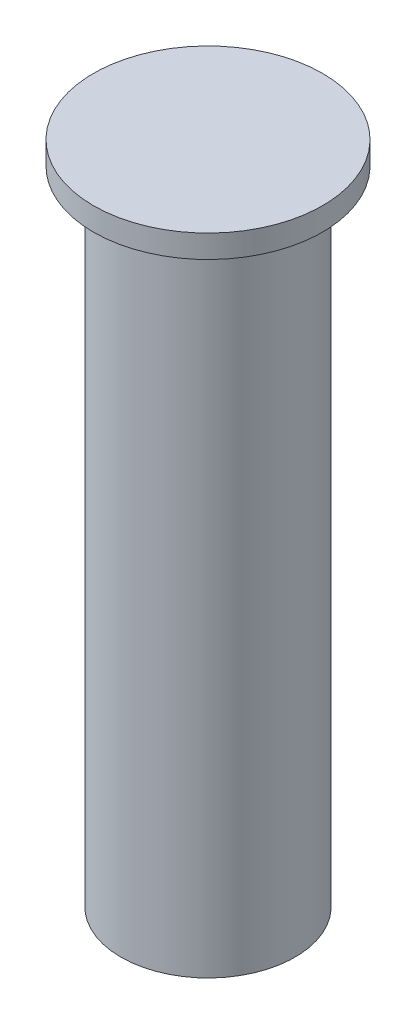
ISO-10303-21;
HEADER;
FILE_DESCRIPTION(('STEP AP214'),'2;1');
FILE_NAME('part.step','',(''),(''),'','','');
FILE_SCHEMA(('AUTOMOTIVE_DESIGN { 1 0 10303 214 1 1 1 1 }'));
ENDSEC;
DATA;
#1=APPLICATION_CONTEXT('core data for automotive mechanical design processes');
#2=APPLICATION_PROTOCOL_DEFINITION('international standard','automotive_design',2000,#1);
#3=PRODUCT_CONTEXT('',#1,'mechanical');
#4=PRODUCT('Part','Part','',(#3));
#5=PRODUCT_RELATED_PRODUCT_CATEGORY('part','',(#4));
#6=PRODUCT_DEFINITION_FORMATION('','',#4);
#7=PRODUCT_DEFINITION_CONTEXT('part definition',#1,'design');
#8=PRODUCT_DEFINITION('design','',#6,#7);
#9=PRODUCT_DEFINITION_SHAPE('','',#8);
#10=(LENGTH_UNIT() NAMED_UNIT(*) SI_UNIT(.MILLI.,.METRE.));
#11=(NAMED_UNIT(*) PLANE_ANGLE_UNIT() SI_UNIT($,.RADIAN.));
#12=(NAMED_UNIT(*) SI_UNIT($,.STERADIAN.) SOLID_ANGLE_UNIT());
#13=UNCERTAINTY_MEASURE_WITH_UNIT(LENGTH_MEASURE(1.E-05),#10,'distance_accuracy_value','');
#14=(GEOMETRIC_REPRESENTATION_CONTEXT(3) GLOBAL_UNCERTAINTY_ASSIGNED_CONTEXT((#13)) GLOBAL_UNIT_ASSIGNED_CONTEXT((#10,
#11,#12)) REPRESENTATION_CONTEXT('',''));
#15=CARTESIAN_POINT('',(0.,0.,0.));
#16=DIRECTION('',(0.,0.,1.));
#17=DIRECTION('',(1.,0.,0.));
#18=AXIS2_PLACEMENT_3D('',#15,#16,#17);
#19=CARTESIAN_POINT('',(0.,1400.,0.));
#20=DIRECTION('',(0.,-1.,0.));
#21=DIRECTION('',(0.,0.,-1.));
#22=AXIS2_PLACEMENT_3D('',#19,#20,#21);
#23=CYLINDRICAL_SURFACE('',#22,190.);
#24=CARTESIAN_POINT('',(0.,1400.,0.));
#25=DIRECTION('',(0.,1.,0.));
#26=DIRECTION('',(0.,0.,1.));
#27=AXIS2_PLACEMENT_3D('',#24,#25,#26);
#28=CIRCLE('',#27,190.);
#29=CARTESIAN_POINT('',(0.,1400.,190.));
#30=VERTEX_POINT('',#29);
#31=EDGE_CURVE('E10',#30,#30,#28,.T.);
#32=ORIENTED_EDGE('',*,*,#31,.F.);
#33=EDGE_LOOP('',(#32));
#34=FACE_BOUND('',#33,.T.);
#35=CARTESIAN_POINT('',(0.,0.,0.));
#36=DIRECTION('',(0.,1.,0.));
#37=DIRECTION('',(0.,0.,1.));
#38=AXIS2_PLACEMENT_3D('',#35,#36,#37);
#39=CIRCLE('',#38,190.);
#40=CARTESIAN_POINT('',(0.,0.,190.));
#41=VERTEX_POINT('',#40);
#42=EDGE_CURVE('E52',#41,#41,#39,.T.);
#43=ORIENTED_EDGE('',*,*,#42,.T.);
#44=EDGE_LOOP('',(#43));
#45=FACE_BOUND('',#44,.T.);
#46=ADVANCED_FACE('F49',(#34,#45),#23,.T.);
#47=CARTESIAN_POINT('',(0.,0.,0.));
#48=DIRECTION('',(0.,1.,0.));
#49=DIRECTION('',(0.,0.,1.));
#50=AXIS2_PLACEMENT_3D('',#47,#48,#49);
#51=PLANE('',#50);
#52=ORIENTED_EDGE('',*,*,#42,.F.);
#53=EDGE_LOOP('',(#52));
#54=FACE_BOUND('',#53,.T.);
#55=ADVANCED_FACE('F76',(#54),#51,.F.);
#56=CARTESIAN_POINT('',(0.,1450.,0.));
#57=DIRECTION('',(0.,-1.,0.));
#58=DIRECTION('',(0.,0.,-1.));
#59=AXIS2_PLACEMENT_3D('',#56,#57,#58);
#60=CYLINDRICAL_SURFACE('',#59,250.);
#61=CARTESIAN_POINT('',(0.,1450.,0.));
#62=DIRECTION('',(0.,1.,0.));
#63=DIRECTION('',(0.,0.,1.));
#64=AXIS2_PLACEMENT_3D('',#61,#62,#63);
#65=CIRCLE('',#64,250.);
#66=CARTESIAN_POINT('',(0.,1450.,250.));
#67=VERTEX_POINT('',#66);
#68=EDGE_CURVE('E61',#67,#67,#65,.T.);
#69=ORIENTED_EDGE('',*,*,#68,.F.);
#70=EDGE_LOOP('',(#69));
#71=FACE_BOUND('',#70,.T.);
#72=CARTESIAN_POINT('',(0.,1400.,0.));
#73=DIRECTION('',(0.,1.,0.));
#74=DIRECTION('',(0.,0.,1.));
#75=AXIS2_PLACEMENT_3D('',#72,#73,#74);
#76=CIRCLE('',#75,250.);
#77=CARTESIAN_POINT('',(0.,1400.,250.));
#78=VERTEX_POINT('',#77);
#79=EDGE_CURVE('E63',#78,#78,#76,.T.);
#80=ORIENTED_EDGE('',*,*,#79,.T.);
#81=EDGE_LOOP('',(#80));
#82=FACE_BOUND('',#81,.T.);
#83=ADVANCED_FACE('F73',(#71,#82),#60,.T.);
#84=CARTESIAN_POINT('',(0.,1450.,0.));
#85=DIRECTION('',(0.,1.,0.));
#86=DIRECTION('',(0.,0.,1.));
#87=AXIS2_PLACEMENT_3D('',#84,#85,#86);
#88=PLANE('',#87);
#89=ORIENTED_EDGE('',*,*,#68,.T.);
#90=EDGE_LOOP('',(#89));
#91=FACE_BOUND('',#90,.T.);
#92=ADVANCED_FACE('F71',(#91),#88,.T.);
#93=CARTESIAN_POINT('',(0.,1400.,0.));
#94=DIRECTION('',(0.,1.,0.));
#95=DIRECTION('',(0.,0.,1.));
#96=AXIS2_PLACEMENT_3D('',#93,#94,#95);
#97=PLANE('',#96);
#98=ORIENTED_EDGE('',*,*,#31,.T.);
#99=EDGE_LOOP('',(#98));
#100=FACE_BOUND('',#99,.T.);
#101=ORIENTED_EDGE('',*,*,#79,.F.);
#102=EDGE_LOOP('',(#101));
#103=FACE_BOUND('',#102,.T.);
#104=ADVANCED_FACE('F80',(#100,#103),#97,.F.);
#105=CLOSED_SHELL('',(#46,#55,#83,#92,#104));
#106=MANIFOLD_SOLID_BREP('B2',#105);
#107=ADVANCED_BREP_SHAPE_REPRESENTATION('',(#18,#106),#14);
#108=SHAPE_DEFINITION_REPRESENTATION(#9,#107);
ENDSEC;
END-ISO-10303-21;
